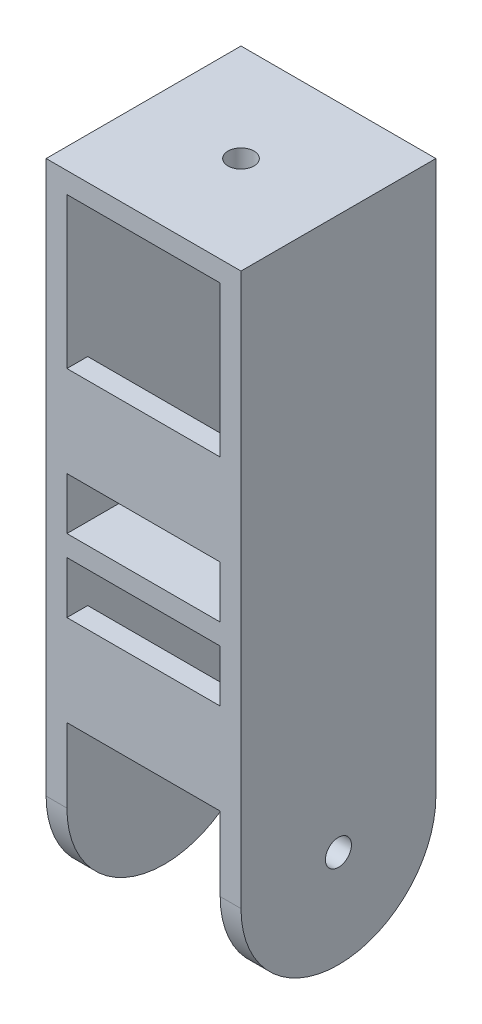
ISO-10303-21;
HEADER;
FILE_DESCRIPTION(('STEP AP214'),'2;1');
FILE_NAME('part.step','',(''),(''),'','','');
FILE_SCHEMA(('AUTOMOTIVE_DESIGN { 1 0 10303 214 1 1 1 1 }'));
ENDSEC;
DATA;
#1=APPLICATION_CONTEXT('core data for automotive mechanical design processes');
#2=APPLICATION_PROTOCOL_DEFINITION('international standard','automotive_design',2000,#1);
#3=PRODUCT_CONTEXT('',#1,'mechanical');
#4=PRODUCT('Part','Part','',(#3));
#5=PRODUCT_RELATED_PRODUCT_CATEGORY('part','',(#4));
#6=PRODUCT_DEFINITION_FORMATION('','',#4);
#7=PRODUCT_DEFINITION_CONTEXT('part definition',#1,'design');
#8=PRODUCT_DEFINITION('design','',#6,#7);
#9=PRODUCT_DEFINITION_SHAPE('','',#8);
#10=(LENGTH_UNIT() NAMED_UNIT(*) SI_UNIT(.MILLI.,.METRE.));
#11=(NAMED_UNIT(*) PLANE_ANGLE_UNIT() SI_UNIT($,.RADIAN.));
#12=(NAMED_UNIT(*) SI_UNIT($,.STERADIAN.) SOLID_ANGLE_UNIT());
#13=UNCERTAINTY_MEASURE_WITH_UNIT(LENGTH_MEASURE(1.E-05),#10,'distance_accuracy_value','');
#14=(GEOMETRIC_REPRESENTATION_CONTEXT(3) GLOBAL_UNCERTAINTY_ASSIGNED_CONTEXT((#13)) GLOBAL_UNIT_ASSIGNED_CONTEXT((#10,
#11,#12)) REPRESENTATION_CONTEXT('',''));
#15=CARTESIAN_POINT('',(0.,0.,0.));
#16=DIRECTION('',(0.,0.,1.));
#17=DIRECTION('',(1.,0.,0.));
#18=AXIS2_PLACEMENT_3D('',#15,#16,#17);
#19=CARTESIAN_POINT('',(59.5,-212.5,37.5));
#20=DIRECTION('',(-1.,0.,0.));
#21=DIRECTION('',(0.,-1.,0.));
#22=AXIS2_PLACEMENT_3D('',#19,#20,#21);
#23=PLANE('',#22);
#24=CARTESIAN_POINT('',(59.5,-212.5,37.5));
#25=DIRECTION('',(-1.,0.,0.));
#26=DIRECTION('',(0.,-1.,0.));
#27=AXIS2_PLACEMENT_3D('',#24,#25,#26);
#28=CIRCLE('',#27,15.);
#29=CARTESIAN_POINT('',(59.5,-227.5,37.5));
#30=VERTEX_POINT('',#29);
#31=EDGE_CURVE('E352',#30,#30,#28,.T.);
#32=ORIENTED_EDGE('',*,*,#31,.T.);
#33=EDGE_LOOP('',(#32));
#34=FACE_BOUND('',#33,.T.);
#35=CARTESIAN_POINT('',(59.5,-212.5,37.5));
#36=DIRECTION('',(-1.,0.,0.));
#37=DIRECTION('',(0.,-1.,0.));
#38=AXIS2_PLACEMENT_3D('',#35,#36,#37);
#39=CIRCLE('',#38,10.);
#40=CARTESIAN_POINT('',(59.5,-222.5,37.5));
#41=VERTEX_POINT('',#40);
#42=EDGE_CURVE('E348',#41,#41,#39,.T.);
#43=ORIENTED_EDGE('',*,*,#42,.F.);
#44=EDGE_LOOP('',(#43));
#45=FACE_BOUND('',#44,.T.);
#46=ADVANCED_FACE('F35',(#34,#45),#23,.T.);
#47=CARTESIAN_POINT('',(67.,0.,75.));
#48=DIRECTION('',(1.,0.,0.));
#49=DIRECTION('',(0.,1.,0.));
#50=AXIS2_PLACEMENT_3D('',#47,#48,#49);
#51=PLANE('',#50);
#52=DIRECTION('',(0.,1.,0.));
#53=VECTOR('',#52,1.);
#54=CARTESIAN_POINT('',(67.,-149.,67.));
#55=LINE('',#54,#53);
#56=CARTESIAN_POINT('',(67.,-184.,67.));
#57=VERTEX_POINT('',#56);
#58=CARTESIAN_POINT('',(67.,-149.,67.));
#59=VERTEX_POINT('',#58);
#60=EDGE_CURVE('E232',#57,#59,#55,.T.);
#61=ORIENTED_EDGE('',*,*,#60,.T.);
#62=DIRECTION('',(0.,0.,1.));
#63=VECTOR('',#62,1.);
#64=CARTESIAN_POINT('',(67.,-149.,67.));
#65=LINE('',#64,#63);
#66=CARTESIAN_POINT('',(67.,-149.,75.));
#67=VERTEX_POINT('',#66);
#68=EDGE_CURVE('E254',#59,#67,#65,.T.);
#69=ORIENTED_EDGE('',*,*,#68,.T.);
#70=DIRECTION('',(0.,-1.,0.));
#71=VECTOR('',#70,1.);
#72=CARTESIAN_POINT('',(67.,0.,75.));
#73=LINE('',#72,#71);
#74=CARTESIAN_POINT('',(67.,-129.,75.));
#75=VERTEX_POINT('',#74);
#76=EDGE_CURVE('E367',#75,#67,#73,.T.);
#77=ORIENTED_EDGE('',*,*,#76,.F.);
#78=DIRECTION('',(0.,0.,-1.));
#79=VECTOR('',#78,1.);
#80=CARTESIAN_POINT('',(67.,-129.,75.));
#81=LINE('',#80,#79);
#82=CARTESIAN_POINT('',(67.,-129.,0.));
#83=VERTEX_POINT('',#82);
#84=EDGE_CURVE('E430',#75,#83,#81,.T.);
#85=ORIENTED_EDGE('',*,*,#84,.T.);
#86=DIRECTION('',(0.,-1.,0.));
#87=VECTOR('',#86,1.);
#88=CARTESIAN_POINT('',(67.,0.,0.));
#89=LINE('',#88,#87);
#90=CARTESIAN_POINT('',(67.,-149.,0.));
#91=VERTEX_POINT('',#90);
#92=EDGE_CURVE('E396',#83,#91,#89,.T.);
#93=ORIENTED_EDGE('',*,*,#92,.T.);
#94=DIRECTION('',(0.,0.,1.));
#95=VECTOR('',#94,1.);
#96=CARTESIAN_POINT('',(67.,-149.,75.));
#97=LINE('',#96,#95);
#98=CARTESIAN_POINT('',(67.,-149.,7.99999999999999));
#99=VERTEX_POINT('',#98);
#100=EDGE_CURVE('E307',#91,#99,#97,.T.);
#101=ORIENTED_EDGE('',*,*,#100,.T.);
#102=DIRECTION('',(0.,1.,0.));
#103=VECTOR('',#102,1.);
#104=CARTESIAN_POINT('',(67.,0.,7.99999999999999));
#105=LINE('',#104,#103);
#106=CARTESIAN_POINT('',(67.,-184.,7.99999999999999));
#107=VERTEX_POINT('',#106);
#108=EDGE_CURVE('E312',#107,#99,#105,.T.);
#109=ORIENTED_EDGE('',*,*,#108,.F.);
#110=DIRECTION('',(0.,0.,-1.));
#111=VECTOR('',#110,1.);
#112=CARTESIAN_POINT('',(67.,-184.,75.));
#113=LINE('',#112,#111);
#114=CARTESIAN_POINT('',(67.,-184.,0.));
#115=VERTEX_POINT('',#114);
#116=EDGE_CURVE('E302',#107,#115,#113,.T.);
#117=ORIENTED_EDGE('',*,*,#116,.T.);
#118=CARTESIAN_POINT('',(67.,-212.5,0.));
#119=VERTEX_POINT('',#118);
#120=EDGE_CURVE('E395',#115,#119,#89,.T.);
#121=ORIENTED_EDGE('',*,*,#120,.T.);
#122=CARTESIAN_POINT('',(67.,-212.5,37.5));
#123=DIRECTION('',(1.,0.,0.));
#124=DIRECTION('',(0.,1.,0.));
#125=AXIS2_PLACEMENT_3D('',#122,#123,#124);
#126=CIRCLE('',#125,37.5);
#127=CARTESIAN_POINT('',(67.,-250.,37.5));
#128=VERTEX_POINT('',#127);
#129=EDGE_CURVE('E455',#119,#128,#126,.F.);
#130=ORIENTED_EDGE('',*,*,#129,.T.);
#131=CARTESIAN_POINT('',(67.,-212.5,37.5));
#132=DIRECTION('',(1.,0.,0.));
#133=DIRECTION('',(0.,1.,0.));
#134=AXIS2_PLACEMENT_3D('',#131,#132,#133);
#135=CIRCLE('',#134,37.5);
#136=CARTESIAN_POINT('',(67.,-212.5,75.));
#137=VERTEX_POINT('',#136);
#138=EDGE_CURVE('E453',#128,#137,#135,.F.);
#139=ORIENTED_EDGE('',*,*,#138,.T.);
#140=CARTESIAN_POINT('',(67.,-184.,75.));
#141=VERTEX_POINT('',#140);
#142=EDGE_CURVE('E253',#141,#137,#73,.T.);
#143=ORIENTED_EDGE('',*,*,#142,.F.);
#144=DIRECTION('',(0.,0.,1.));
#145=VECTOR('',#144,1.);
#146=CARTESIAN_POINT('',(67.,-184.,67.));
#147=LINE('',#146,#145);
#148=EDGE_CURVE('E246',#57,#141,#147,.T.);
#149=ORIENTED_EDGE('',*,*,#148,.F.);
#150=EDGE_LOOP('',(#61,#69,#77,#85,#93,#101,#109,#117,#121,#130,#139,#143,#149));
#151=FACE_BOUND('',#150,.T.);
#152=CARTESIAN_POINT('',(67.,-212.5,37.5));
#153=DIRECTION('',(1.,0.,0.));
#154=DIRECTION('',(0.,1.,0.));
#155=AXIS2_PLACEMENT_3D('',#152,#153,#154);
#156=CIRCLE('',#155,15.);
#157=CARTESIAN_POINT('',(67.,-197.5,37.5));
#158=VERTEX_POINT('',#157);
#159=EDGE_CURVE('E43',#158,#158,#156,.F.);
#160=ORIENTED_EDGE('',*,*,#159,.F.);
#161=EDGE_LOOP('',(#160));
#162=FACE_BOUND('',#161,.T.);
#163=ADVANCED_FACE('F250',(#151,#162),#51,.F.);
#164=CARTESIAN_POINT('',(0.,-121.,75.));
#165=DIRECTION('',(0.,1.,0.));
#166=DIRECTION('',(-1.,0.,0.));
#167=AXIS2_PLACEMENT_3D('',#164,#165,#166);
#168=PLANE('',#167);
#169=DIRECTION('',(1.,0.,0.));
#170=VECTOR('',#169,1.);
#171=CARTESIAN_POINT('',(0.,-121.,0.));
#172=LINE('',#171,#170);
#173=CARTESIAN_POINT('',(8.00000000000001,-121.,0.));
#174=VERTEX_POINT('',#173);
#175=CARTESIAN_POINT('',(67.,-121.,0.));
#176=VERTEX_POINT('',#175);
#177=EDGE_CURVE('E406',#174,#176,#172,.T.);
#178=ORIENTED_EDGE('',*,*,#177,.F.);
#179=DIRECTION('',(0.,0.,-1.));
#180=VECTOR('',#179,1.);
#181=CARTESIAN_POINT('',(8.00000000000001,-121.,75.));
#182=LINE('',#181,#180);
#183=CARTESIAN_POINT('',(8.00000000000001,-121.,75.));
#184=VERTEX_POINT('',#183);
#185=EDGE_CURVE('E422',#184,#174,#182,.T.);
#186=ORIENTED_EDGE('',*,*,#185,.F.);
#187=DIRECTION('',(1.,0.,0.));
#188=VECTOR('',#187,1.);
#189=CARTESIAN_POINT('',(0.,-121.,75.));
#190=LINE('',#189,#188);
#191=CARTESIAN_POINT('',(67.,-121.,75.));
#192=VERTEX_POINT('',#191);
#193=EDGE_CURVE('E380',#184,#192,#190,.T.);
#194=ORIENTED_EDGE('',*,*,#193,.T.);
#195=DIRECTION('',(0.,0.,-1.));
#196=VECTOR('',#195,1.);
#197=CARTESIAN_POINT('',(67.,-121.,75.));
#198=LINE('',#197,#196);
#199=EDGE_CURVE('E414',#192,#176,#198,.T.);
#200=ORIENTED_EDGE('',*,*,#199,.T.);
#201=EDGE_LOOP('',(#178,#186,#194,#200));
#202=FACE_BOUND('',#201,.T.);
#203=ADVANCED_FACE('F471',(#202),#168,.T.);
#204=CARTESIAN_POINT('',(8.,0.,75.));
#205=DIRECTION('',(1.,0.,0.));
#206=DIRECTION('',(0.,1.,0.));
#207=AXIS2_PLACEMENT_3D('',#204,#205,#206);
#208=PLANE('',#207);
#209=DIRECTION('',(0.,0.,1.));
#210=VECTOR('',#209,1.);
#211=CARTESIAN_POINT('',(8.00000000000001,-66.,67.));
#212=LINE('',#211,#210);
#213=CARTESIAN_POINT('',(8.00000000000001,-66.,67.));
#214=VERTEX_POINT('',#213);
#215=CARTESIAN_POINT('',(8.00000000000001,-66.,75.));
#216=VERTEX_POINT('',#215);
#217=EDGE_CURVE('E277',#214,#216,#212,.T.);
#218=ORIENTED_EDGE('',*,*,#217,.F.);
#219=DIRECTION('',(0.,-1.,0.));
#220=VECTOR('',#219,1.);
#221=CARTESIAN_POINT('',(8.00000000000001,-66.,67.));
#222=LINE('',#221,#220);
#223=CARTESIAN_POINT('',(8.00000000000001,-101.,67.));
#224=VERTEX_POINT('',#223);
#225=EDGE_CURVE('E260',#214,#224,#222,.T.);
#226=ORIENTED_EDGE('',*,*,#225,.T.);
#227=DIRECTION('',(0.,0.,1.));
#228=VECTOR('',#227,1.);
#229=CARTESIAN_POINT('',(8.00000000000001,-101.,67.));
#230=LINE('',#229,#228);
#231=CARTESIAN_POINT('',(8.00000000000001,-101.,75.));
#232=VERTEX_POINT('',#231);
#233=EDGE_CURVE('E272',#224,#232,#230,.T.);
#234=ORIENTED_EDGE('',*,*,#233,.T.);
#235=DIRECTION('',(0.,-1.,0.));
#236=VECTOR('',#235,1.);
#237=CARTESIAN_POINT('',(8.,0.,75.));
#238=LINE('',#237,#236);
#239=EDGE_CURVE('E383',#232,#184,#238,.T.);
#240=ORIENTED_EDGE('',*,*,#239,.T.);
#241=ORIENTED_EDGE('',*,*,#185,.T.);
#242=DIRECTION('',(0.,-1.,0.));
#243=VECTOR('',#242,1.);
#244=CARTESIAN_POINT('',(8.,0.,0.));
#245=LINE('',#244,#243);
#246=CARTESIAN_POINT('',(8.00000000000001,-101.,0.));
#247=VERTEX_POINT('',#246);
#248=EDGE_CURVE('E409',#247,#174,#245,.T.);
#249=ORIENTED_EDGE('',*,*,#248,.F.);
#250=DIRECTION('',(0.,0.,-1.));
#251=VECTOR('',#250,1.);
#252=CARTESIAN_POINT('',(8.00000000000001,-101.,75.));
#253=LINE('',#252,#251);
#254=CARTESIAN_POINT('',(8.00000000000001,-101.,8.));
#255=VERTEX_POINT('',#254);
#256=EDGE_CURVE('E329',#255,#247,#253,.T.);
#257=ORIENTED_EDGE('',*,*,#256,.F.);
#258=DIRECTION('',(0.,1.,0.));
#259=VECTOR('',#258,1.);
#260=CARTESIAN_POINT('',(8.,0.,7.99999999999999));
#261=LINE('',#260,#259);
#262=CARTESIAN_POINT('',(8.00000000000001,-66.,8.));
#263=VERTEX_POINT('',#262);
#264=EDGE_CURVE('E336',#255,#263,#261,.T.);
#265=ORIENTED_EDGE('',*,*,#264,.T.);
#266=DIRECTION('',(0.,0.,1.));
#267=VECTOR('',#266,1.);
#268=CARTESIAN_POINT('',(8.00000000000001,-66.,75.));
#269=LINE('',#268,#267);
#270=CARTESIAN_POINT('',(8.00000000000001,-66.,0.));
#271=VERTEX_POINT('',#270);
#272=EDGE_CURVE('E334',#271,#263,#269,.T.);
#273=ORIENTED_EDGE('',*,*,#272,.F.);
#274=CARTESIAN_POINT('',(8.,-8.00000000000001,0.));
#275=VERTEX_POINT('',#274);
#276=EDGE_CURVE('E393',#275,#271,#245,.T.);
#277=ORIENTED_EDGE('',*,*,#276,.F.);
#278=DIRECTION('',(0.,0.,-1.));
#279=VECTOR('',#278,1.);
#280=CARTESIAN_POINT('',(8.,-8.00000000000001,75.));
#281=LINE('',#280,#279);
#282=CARTESIAN_POINT('',(8.,-8.00000000000001,75.));
#283=VERTEX_POINT('',#282);
#284=EDGE_CURVE('E420',#283,#275,#281,.T.);
#285=ORIENTED_EDGE('',*,*,#284,.F.);
#286=EDGE_CURVE('E365',#283,#216,#238,.T.);
#287=ORIENTED_EDGE('',*,*,#286,.T.);
#288=EDGE_LOOP('',(#218,#226,#234,#240,#241,#249,#257,#265,#273,#277,#285,#287));
#289=FACE_BOUND('',#288,.T.);
#290=ADVANCED_FACE('F478',(#289),#208,.T.);
#291=CARTESIAN_POINT('',(0.,-8.00000000000001,75.));
#292=DIRECTION('',(0.,-1.,0.));
#293=DIRECTION('',(1.,0.,0.));
#294=AXIS2_PLACEMENT_3D('',#291,#292,#293);
#295=PLANE('',#294);
#296=CARTESIAN_POINT('',(37.5,-8.00000000000001,37.5));
#297=DIRECTION('',(0.,-1.,0.));
#298=DIRECTION('',(1.,0.,0.));
#299=AXIS2_PLACEMENT_3D('',#296,#297,#298);
#300=CIRCLE('',#299,5.);
#301=CARTESIAN_POINT('',(42.5,-8.00000000000001,37.5));
#302=VERTEX_POINT('',#301);
#303=EDGE_CURVE('E342',#302,#302,#300,.T.);
#304=ORIENTED_EDGE('',*,*,#303,.F.);
#305=EDGE_LOOP('',(#304));
#306=FACE_BOUND('',#305,.T.);
#307=DIRECTION('',(-1.,0.,0.));
#308=VECTOR('',#307,1.);
#309=CARTESIAN_POINT('',(0.,-8.00000000000001,0.));
#310=LINE('',#309,#308);
#311=CARTESIAN_POINT('',(67.,-8.,0.));
#312=VERTEX_POINT('',#311);
#313=EDGE_CURVE('E410',#312,#275,#310,.T.);
#314=ORIENTED_EDGE('',*,*,#313,.F.);
#315=DIRECTION('',(0.,0.,-1.));
#316=VECTOR('',#315,1.);
#317=CARTESIAN_POINT('',(67.,-8.,75.));
#318=LINE('',#317,#316);
#319=CARTESIAN_POINT('',(67.,-8.,75.));
#320=VERTEX_POINT('',#319);
#321=EDGE_CURVE('E417',#320,#312,#318,.T.);
#322=ORIENTED_EDGE('',*,*,#321,.F.);
#323=DIRECTION('',(-1.,0.,0.));
#324=VECTOR('',#323,1.);
#325=CARTESIAN_POINT('',(0.,-8.00000000000001,75.));
#326=LINE('',#325,#324);
#327=EDGE_CURVE('E384',#320,#283,#326,.T.);
#328=ORIENTED_EDGE('',*,*,#327,.T.);
#329=ORIENTED_EDGE('',*,*,#284,.T.);
#330=EDGE_LOOP('',(#314,#322,#328,#329));
#331=FACE_BOUND('',#330,.T.);
#332=ADVANCED_FACE('F556',(#306,#331),#295,.T.);
#333=DIRECTION('',(0.,0.,1.));
#334=VECTOR('',#333,1.);
#335=CARTESIAN_POINT('',(8.00000000000002,-149.,67.));
#336=LINE('',#335,#334);
#337=CARTESIAN_POINT('',(8.00000000000002,-149.,67.));
#338=VERTEX_POINT('',#337);
#339=CARTESIAN_POINT('',(8.00000000000002,-149.,75.));
#340=VERTEX_POINT('',#339);
#341=EDGE_CURVE('E55',#338,#340,#336,.T.);
#342=ORIENTED_EDGE('',*,*,#341,.F.);
#343=DIRECTION('',(0.,-1.,0.));
#344=VECTOR('',#343,1.);
#345=CARTESIAN_POINT('',(8.00000000000002,-149.,67.));
#346=LINE('',#345,#344);
#347=CARTESIAN_POINT('',(8.00000000000002,-184.,67.));
#348=VERTEX_POINT('',#347);
#349=EDGE_CURVE('E50',#338,#348,#346,.T.);
#350=ORIENTED_EDGE('',*,*,#349,.T.);
#351=DIRECTION('',(0.,0.,1.));
#352=VECTOR('',#351,1.);
#353=CARTESIAN_POINT('',(8.00000000000002,-184.,67.));
#354=LINE('',#353,#352);
#355=CARTESIAN_POINT('',(8.00000000000002,-184.,75.));
#356=VERTEX_POINT('',#355);
#357=EDGE_CURVE('E248',#348,#356,#354,.T.);
#358=ORIENTED_EDGE('',*,*,#357,.T.);
#359=CARTESIAN_POINT('',(8.00000000000003,-212.5,75.));
#360=VERTEX_POINT('',#359);
#361=EDGE_CURVE('E364',#356,#360,#238,.T.);
#362=ORIENTED_EDGE('',*,*,#361,.T.);
#363=CARTESIAN_POINT('',(8.00000000000003,-212.5,37.5));
#364=DIRECTION('',(1.,0.,0.));
#365=DIRECTION('',(0.,1.,0.));
#366=AXIS2_PLACEMENT_3D('',#363,#364,#365);
#367=CIRCLE('',#366,37.5);
#368=CARTESIAN_POINT('',(8.00000000000003,-250.,37.5));
#369=VERTEX_POINT('',#368);
#370=EDGE_CURVE('E425',#360,#369,#367,.T.);
#371=ORIENTED_EDGE('',*,*,#370,.T.);
#372=CARTESIAN_POINT('',(8.00000000000003,-212.5,37.5));
#373=DIRECTION('',(1.,0.,0.));
#374=DIRECTION('',(0.,1.,0.));
#375=AXIS2_PLACEMENT_3D('',#372,#373,#374);
#376=CIRCLE('',#375,37.5);
#377=CARTESIAN_POINT('',(8.00000000000003,-212.5,0.));
#378=VERTEX_POINT('',#377);
#379=EDGE_CURVE('E435',#369,#378,#376,.T.);
#380=ORIENTED_EDGE('',*,*,#379,.T.);
#381=CARTESIAN_POINT('',(8.00000000000002,-184.,0.));
#382=VERTEX_POINT('',#381);
#383=EDGE_CURVE('E392',#382,#378,#245,.T.);
#384=ORIENTED_EDGE('',*,*,#383,.F.);
#385=DIRECTION('',(0.,0.,-1.));
#386=VECTOR('',#385,1.);
#387=CARTESIAN_POINT('',(8.00000000000002,-184.,75.));
#388=LINE('',#387,#386);
#389=CARTESIAN_POINT('',(8.00000000000002,-184.,8.));
#390=VERTEX_POINT('',#389);
#391=EDGE_CURVE('E296',#390,#382,#388,.T.);
#392=ORIENTED_EDGE('',*,*,#391,.F.);
#393=DIRECTION('',(0.,1.,0.));
#394=VECTOR('',#393,1.);
#395=CARTESIAN_POINT('',(8.,0.,7.99999999999999));
#396=LINE('',#395,#394);
#397=CARTESIAN_POINT('',(8.00000000000002,-149.,8.));
#398=VERTEX_POINT('',#397);
#399=EDGE_CURVE('E309',#390,#398,#396,.T.);
#400=ORIENTED_EDGE('',*,*,#399,.T.);
#401=DIRECTION('',(0.,0.,1.));
#402=VECTOR('',#401,1.);
#403=CARTESIAN_POINT('',(8.00000000000002,-149.,75.));
#404=LINE('',#403,#402);
#405=CARTESIAN_POINT('',(8.00000000000002,-149.,0.));
#406=VERTEX_POINT('',#405);
#407=EDGE_CURVE('E305',#406,#398,#404,.T.);
#408=ORIENTED_EDGE('',*,*,#407,.F.);
#409=CARTESIAN_POINT('',(8.00000000000002,-129.,0.));
#410=VERTEX_POINT('',#409);
#411=EDGE_CURVE('E388',#410,#406,#245,.T.);
#412=ORIENTED_EDGE('',*,*,#411,.F.);
#413=DIRECTION('',(0.,0.,-1.));
#414=VECTOR('',#413,1.);
#415=CARTESIAN_POINT('',(8.00000000000002,-129.,75.));
#416=LINE('',#415,#414);
#417=CARTESIAN_POINT('',(8.00000000000002,-129.,75.));
#418=VERTEX_POINT('',#417);
#419=EDGE_CURVE('E418',#418,#410,#416,.T.);
#420=ORIENTED_EDGE('',*,*,#419,.F.);
#421=EDGE_CURVE('E361',#418,#340,#238,.T.);
#422=ORIENTED_EDGE('',*,*,#421,.T.);
#423=EDGE_LOOP('',(#342,#350,#358,#362,#371,#380,#384,#392,#400,#408,#412,#420,#422));
#424=FACE_BOUND('',#423,.T.);
#425=ADVANCED_FACE('F548',(#424),#208,.T.);
#426=CARTESIAN_POINT('',(0.,-129.,75.));
#427=DIRECTION('',(0.,1.,0.));
#428=DIRECTION('',(0.,0.,1.));
#429=AXIS2_PLACEMENT_3D('',#426,#427,#428);
#430=PLANE('',#429);
#431=DIRECTION('',(1.,0.,0.));
#432=VECTOR('',#431,1.);
#433=CARTESIAN_POINT('',(0.,-129.,0.));
#434=LINE('',#433,#432);
#435=EDGE_CURVE('E391',#410,#83,#434,.T.);
#436=ORIENTED_EDGE('',*,*,#435,.T.);
#437=ORIENTED_EDGE('',*,*,#84,.F.);
#438=DIRECTION('',(1.,0.,0.));
#439=VECTOR('',#438,1.);
#440=CARTESIAN_POINT('',(0.,-129.,75.));
#441=LINE('',#440,#439);
#442=EDGE_CURVE('E363',#418,#75,#441,.T.);
#443=ORIENTED_EDGE('',*,*,#442,.F.);
#444=ORIENTED_EDGE('',*,*,#419,.T.);
#445=EDGE_LOOP('',(#436,#437,#443,#444));
#446=FACE_BOUND('',#445,.T.);
#447=ADVANCED_FACE('F665',(#446),#430,.F.);
#448=CARTESIAN_POINT('',(75.,0.,75.));
#449=DIRECTION('',(1.,0.,0.));
#450=DIRECTION('',(0.,1.,0.));
#451=AXIS2_PLACEMENT_3D('',#448,#449,#450);
#452=PLANE('',#451);
#453=CARTESIAN_POINT('',(75.,-212.5,37.5));
#454=DIRECTION('',(1.,0.,0.));
#455=DIRECTION('',(0.,1.,0.));
#456=AXIS2_PLACEMENT_3D('',#453,#454,#455);
#457=CIRCLE('',#456,37.5);
#458=CARTESIAN_POINT('',(75.,-250.,37.5));
#459=VERTEX_POINT('',#458);
#460=CARTESIAN_POINT('',(75.,-212.5,0.));
#461=VERTEX_POINT('',#460);
#462=EDGE_CURVE('E450',#459,#461,#457,.T.);
#463=ORIENTED_EDGE('',*,*,#462,.T.);
#464=DIRECTION('',(0.,-1.,0.));
#465=VECTOR('',#464,1.);
#466=CARTESIAN_POINT('',(75.,0.,0.));
#467=LINE('',#466,#465);
#468=CARTESIAN_POINT('',(75.,0.,0.));
#469=VERTEX_POINT('',#468);
#470=EDGE_CURVE('E398',#469,#461,#467,.T.);
#471=ORIENTED_EDGE('',*,*,#470,.F.);
#472=DIRECTION('',(0.,0.,-1.));
#473=VECTOR('',#472,1.);
#474=CARTESIAN_POINT('',(75.,0.,75.));
#475=LINE('',#474,#473);
#476=CARTESIAN_POINT('',(75.,0.,75.));
#477=VERTEX_POINT('',#476);
#478=EDGE_CURVE('E428',#477,#469,#475,.T.);
#479=ORIENTED_EDGE('',*,*,#478,.F.);
#480=DIRECTION('',(0.,-1.,0.));
#481=VECTOR('',#480,1.);
#482=CARTESIAN_POINT('',(75.,0.,75.));
#483=LINE('',#482,#481);
#484=CARTESIAN_POINT('',(75.,-212.5,75.));
#485=VERTEX_POINT('',#484);
#486=EDGE_CURVE('E370',#477,#485,#483,.T.);
#487=ORIENTED_EDGE('',*,*,#486,.T.);
#488=CARTESIAN_POINT('',(75.,-212.5,37.5));
#489=DIRECTION('',(1.,0.,0.));
#490=DIRECTION('',(0.,1.,0.));
#491=AXIS2_PLACEMENT_3D('',#488,#489,#490);
#492=CIRCLE('',#491,37.5);
#493=EDGE_CURVE('E448',#485,#459,#492,.T.);
#494=ORIENTED_EDGE('',*,*,#493,.T.);
#495=EDGE_LOOP('',(#463,#471,#479,#487,#494));
#496=FACE_BOUND('',#495,.T.);
#497=CARTESIAN_POINT('',(75.,-212.5,37.5));
#498=DIRECTION('',(1.,0.,0.));
#499=DIRECTION('',(0.,1.,0.));
#500=AXIS2_PLACEMENT_3D('',#497,#498,#499);
#501=CIRCLE('',#500,5.);
#502=CARTESIAN_POINT('',(75.,-207.5,37.5));
#503=VERTEX_POINT('',#502);
#504=EDGE_CURVE('E357',#503,#503,#501,.T.);
#505=ORIENTED_EDGE('',*,*,#504,.F.);
#506=EDGE_LOOP('',(#505));
#507=FACE_BOUND('',#506,.T.);
#508=ADVANCED_FACE('F532',(#496,#507),#452,.T.);
#509=CARTESIAN_POINT('',(0.,0.,75.));
#510=DIRECTION('',(0.,1.,0.));
#511=DIRECTION('',(-1.,0.,0.));
#512=AXIS2_PLACEMENT_3D('',#509,#510,#511);
#513=PLANE('',#512);
#514=CARTESIAN_POINT('',(37.5,0.,37.5));
#515=DIRECTION('',(0.,1.,0.));
#516=DIRECTION('',(-1.,0.,0.));
#517=AXIS2_PLACEMENT_3D('',#514,#515,#516);
#518=CIRCLE('',#517,5.);
#519=CARTESIAN_POINT('',(32.5,0.,37.5));
#520=VERTEX_POINT('',#519);
#521=EDGE_CURVE('E339',#520,#520,#518,.T.);
#522=ORIENTED_EDGE('',*,*,#521,.F.);
#523=EDGE_LOOP('',(#522));
#524=FACE_BOUND('',#523,.T.);
#525=DIRECTION('',(1.,0.,0.));
#526=VECTOR('',#525,1.);
#527=CARTESIAN_POINT('',(0.,0.,0.));
#528=LINE('',#527,#526);
#529=CARTESIAN_POINT('',(0.,0.,0.));
#530=VERTEX_POINT('',#529);
#531=EDGE_CURVE('E401',#530,#469,#528,.T.);
#532=ORIENTED_EDGE('',*,*,#531,.F.);
#533=DIRECTION('',(0.,0.,-1.));
#534=VECTOR('',#533,1.);
#535=CARTESIAN_POINT('',(0.,0.,75.));
#536=LINE('',#535,#534);
#537=CARTESIAN_POINT('',(0.,0.,75.));
#538=VERTEX_POINT('',#537);
#539=EDGE_CURVE('E426',#538,#530,#536,.T.);
#540=ORIENTED_EDGE('',*,*,#539,.F.);
#541=DIRECTION('',(1.,0.,0.));
#542=VECTOR('',#541,1.);
#543=CARTESIAN_POINT('',(0.,0.,75.));
#544=LINE('',#543,#542);
#545=EDGE_CURVE('E374',#538,#477,#544,.T.);
#546=ORIENTED_EDGE('',*,*,#545,.T.);
#547=ORIENTED_EDGE('',*,*,#478,.T.);
#548=EDGE_LOOP('',(#532,#540,#546,#547));
#549=FACE_BOUND('',#548,.T.);
#550=ADVANCED_FACE('F496',(#524,#549),#513,.T.);
#551=CARTESIAN_POINT('',(0.,0.,75.));
#552=DIRECTION('',(1.,0.,0.));
#553=DIRECTION('',(0.,1.,0.));
#554=AXIS2_PLACEMENT_3D('',#551,#552,#553);
#555=PLANE('',#554);
#556=DIRECTION('',(0.,-1.,0.));
#557=VECTOR('',#556,1.);
#558=CARTESIAN_POINT('',(0.,0.,0.));
#559=LINE('',#558,#557);
#560=CARTESIAN_POINT('',(0.,-212.5,0.));
#561=VERTEX_POINT('',#560);
#562=EDGE_CURVE('E404',#530,#561,#559,.T.);
#563=ORIENTED_EDGE('',*,*,#562,.T.);
#564=CARTESIAN_POINT('',(0.,-212.5,37.5));
#565=DIRECTION('',(1.,0.,0.));
#566=DIRECTION('',(0.,1.,0.));
#567=AXIS2_PLACEMENT_3D('',#564,#565,#566);
#568=CIRCLE('',#567,37.5);
#569=CARTESIAN_POINT('',(0.,-250.,37.5));
#570=VERTEX_POINT('',#569);
#571=EDGE_CURVE('E446',#561,#570,#568,.F.);
#572=ORIENTED_EDGE('',*,*,#571,.T.);
#573=CARTESIAN_POINT('',(0.,-212.5,37.5));
#574=DIRECTION('',(1.,0.,0.));
#575=DIRECTION('',(0.,1.,0.));
#576=AXIS2_PLACEMENT_3D('',#573,#574,#575);
#577=CIRCLE('',#576,37.5);
#578=CARTESIAN_POINT('',(0.,-212.5,75.));
#579=VERTEX_POINT('',#578);
#580=EDGE_CURVE('E444',#570,#579,#577,.F.);
#581=ORIENTED_EDGE('',*,*,#580,.T.);
#582=DIRECTION('',(0.,-1.,0.));
#583=VECTOR('',#582,1.);
#584=CARTESIAN_POINT('',(0.,0.,75.));
#585=LINE('',#584,#583);
#586=EDGE_CURVE('E377',#538,#579,#585,.T.);
#587=ORIENTED_EDGE('',*,*,#586,.F.);
#588=ORIENTED_EDGE('',*,*,#539,.T.);
#589=EDGE_LOOP('',(#563,#572,#581,#587,#588));
#590=FACE_BOUND('',#589,.T.);
#591=ADVANCED_FACE('F487',(#590),#555,.F.);
#592=DIRECTION('',(0.,1.,0.));
#593=VECTOR('',#592,1.);
#594=CARTESIAN_POINT('',(67.,-66.,67.));
#595=LINE('',#594,#593);
#596=CARTESIAN_POINT('',(67.,-101.,67.));
#597=VERTEX_POINT('',#596);
#598=CARTESIAN_POINT('',(67.,-66.,67.));
#599=VERTEX_POINT('',#598);
#600=EDGE_CURVE('E266',#597,#599,#595,.T.);
#601=ORIENTED_EDGE('',*,*,#600,.T.);
#602=DIRECTION('',(0.,0.,1.));
#603=VECTOR('',#602,1.);
#604=CARTESIAN_POINT('',(67.,-66.,67.));
#605=LINE('',#604,#603);
#606=CARTESIAN_POINT('',(67.,-66.,75.));
#607=VERTEX_POINT('',#606);
#608=EDGE_CURVE('E281',#599,#607,#605,.T.);
#609=ORIENTED_EDGE('',*,*,#608,.T.);
#610=EDGE_CURVE('E371',#320,#607,#73,.T.);
#611=ORIENTED_EDGE('',*,*,#610,.F.);
#612=ORIENTED_EDGE('',*,*,#321,.T.);
#613=CARTESIAN_POINT('',(67.,-66.,0.));
#614=VERTEX_POINT('',#613);
#615=EDGE_CURVE('E399',#312,#614,#89,.T.);
#616=ORIENTED_EDGE('',*,*,#615,.T.);
#617=DIRECTION('',(0.,0.,1.));
#618=VECTOR('',#617,1.);
#619=CARTESIAN_POINT('',(67.,-66.,75.));
#620=LINE('',#619,#618);
#621=CARTESIAN_POINT('',(67.,-66.,7.99999999999999));
#622=VERTEX_POINT('',#621);
#623=EDGE_CURVE('E332',#614,#622,#620,.T.);
#624=ORIENTED_EDGE('',*,*,#623,.T.);
#625=DIRECTION('',(0.,1.,0.));
#626=VECTOR('',#625,1.);
#627=CARTESIAN_POINT('',(67.,0.,7.99999999999999));
#628=LINE('',#627,#626);
#629=CARTESIAN_POINT('',(67.,-101.,7.99999999999999));
#630=VERTEX_POINT('',#629);
#631=EDGE_CURVE('E11',#630,#622,#628,.T.);
#632=ORIENTED_EDGE('',*,*,#631,.F.);
#633=DIRECTION('',(0.,0.,-1.));
#634=VECTOR('',#633,1.);
#635=CARTESIAN_POINT('',(67.,-101.,75.));
#636=LINE('',#635,#634);
#637=CARTESIAN_POINT('',(67.,-101.,0.));
#638=VERTEX_POINT('',#637);
#639=EDGE_CURVE('E323',#630,#638,#636,.T.);
#640=ORIENTED_EDGE('',*,*,#639,.T.);
#641=EDGE_CURVE('E413',#638,#176,#89,.T.);
#642=ORIENTED_EDGE('',*,*,#641,.T.);
#643=ORIENTED_EDGE('',*,*,#199,.F.);
#644=CARTESIAN_POINT('',(67.,-101.,75.));
#645=VERTEX_POINT('',#644);
#646=EDGE_CURVE('E387',#645,#192,#73,.T.);
#647=ORIENTED_EDGE('',*,*,#646,.F.);
#648=DIRECTION('',(0.,0.,1.));
#649=VECTOR('',#648,1.);
#650=CARTESIAN_POINT('',(67.,-101.,67.));
#651=LINE('',#650,#649);
#652=EDGE_CURVE('E284',#597,#645,#651,.T.);
#653=ORIENTED_EDGE('',*,*,#652,.F.);
#654=EDGE_LOOP('',(#601,#609,#611,#612,#616,#624,#632,#640,#642,#643,#647,#653));
#655=FACE_BOUND('',#654,.T.);
#656=ADVANCED_FACE('F473',(#655),#51,.F.);
#657=CARTESIAN_POINT('',(0.,0.,75.));
#658=DIRECTION('',(0.,0.,1.));
#659=DIRECTION('',(1.,0.,0.));
#660=AXIS2_PLACEMENT_3D('',#657,#658,#659);
#661=PLANE('',#660);
#662=ORIENTED_EDGE('',*,*,#361,.F.);
#663=DIRECTION('',(1.,0.,0.));
#664=VECTOR('',#663,1.);
#665=CARTESIAN_POINT('',(8.00000000000002,-184.,75.));
#666=LINE('',#665,#664);
#667=EDGE_CURVE('E524',#356,#141,#666,.T.);
#668=ORIENTED_EDGE('',*,*,#667,.T.);
#669=ORIENTED_EDGE('',*,*,#142,.T.);
#670=DIRECTION('',(1.,0.,0.));
#671=VECTOR('',#670,1.);
#672=CARTESIAN_POINT('',(75.,-212.5,75.));
#673=LINE('',#672,#671);
#674=EDGE_CURVE('E460',#137,#485,#673,.T.);
#675=ORIENTED_EDGE('',*,*,#674,.T.);
#676=ORIENTED_EDGE('',*,*,#486,.F.);
#677=ORIENTED_EDGE('',*,*,#545,.F.);
#678=ORIENTED_EDGE('',*,*,#586,.T.);
#679=DIRECTION('',(1.,0.,0.));
#680=VECTOR('',#679,1.);
#681=CARTESIAN_POINT('',(8.00000000000003,-212.5,75.));
#682=LINE('',#681,#680);
#683=EDGE_CURVE('E457',#579,#360,#682,.T.);
#684=ORIENTED_EDGE('',*,*,#683,.T.);
#685=EDGE_LOOP('',(#662,#668,#669,#675,#676,#677,#678,#684));
#686=FACE_BOUND('',#685,.T.);
#687=ORIENTED_EDGE('',*,*,#239,.F.);
#688=DIRECTION('',(1.,0.,0.));
#689=VECTOR('',#688,1.);
#690=CARTESIAN_POINT('',(8.00000000000001,-101.,75.));
#691=LINE('',#690,#689);
#692=EDGE_CURVE('E273',#232,#645,#691,.T.);
#693=ORIENTED_EDGE('',*,*,#692,.T.);
#694=ORIENTED_EDGE('',*,*,#646,.T.);
#695=ORIENTED_EDGE('',*,*,#193,.F.);
#696=EDGE_LOOP('',(#687,#693,#694,#695));
#697=FACE_BOUND('',#696,.T.);
#698=ORIENTED_EDGE('',*,*,#76,.T.);
#699=DIRECTION('',(-1.,0.,0.));
#700=VECTOR('',#699,1.);
#701=CARTESIAN_POINT('',(8.00000000000002,-149.,75.));
#702=LINE('',#701,#700);
#703=EDGE_CURVE('E578',#67,#340,#702,.T.);
#704=ORIENTED_EDGE('',*,*,#703,.T.);
#705=ORIENTED_EDGE('',*,*,#421,.F.);
#706=ORIENTED_EDGE('',*,*,#442,.T.);
#707=EDGE_LOOP('',(#698,#704,#705,#706));
#708=FACE_BOUND('',#707,.T.);
#709=DIRECTION('',(-1.,0.,0.));
#710=VECTOR('',#709,1.);
#711=CARTESIAN_POINT('',(8.00000000000001,-66.,75.));
#712=LINE('',#711,#710);
#713=EDGE_CURVE('E263',#607,#216,#712,.T.);
#714=ORIENTED_EDGE('',*,*,#713,.T.);
#715=ORIENTED_EDGE('',*,*,#286,.F.);
#716=ORIENTED_EDGE('',*,*,#327,.F.);
#717=ORIENTED_EDGE('',*,*,#610,.T.);
#718=EDGE_LOOP('',(#714,#715,#716,#717));
#719=FACE_BOUND('',#718,.T.);
#720=ADVANCED_FACE('F486',(#686,#697,#708,#719),#661,.T.);
#721=CARTESIAN_POINT('',(0.,0.,0.));
#722=DIRECTION('',(0.,0.,1.));
#723=DIRECTION('',(1.,0.,0.));
#724=AXIS2_PLACEMENT_3D('',#721,#722,#723);
#725=PLANE('',#724);
#726=ORIENTED_EDGE('',*,*,#120,.F.);
#727=DIRECTION('',(-1.,0.,0.));
#728=VECTOR('',#727,1.);
#729=CARTESIAN_POINT('',(75.,-184.,0.));
#730=LINE('',#729,#728);
#731=EDGE_CURVE('E280',#115,#382,#730,.T.);
#732=ORIENTED_EDGE('',*,*,#731,.T.);
#733=ORIENTED_EDGE('',*,*,#383,.T.);
#734=DIRECTION('',(1.,0.,0.));
#735=VECTOR('',#734,1.);
#736=CARTESIAN_POINT('',(0.,-212.5,0.));
#737=LINE('',#736,#735);
#738=EDGE_CURVE('E441',#378,#561,#737,.F.);
#739=ORIENTED_EDGE('',*,*,#738,.T.);
#740=ORIENTED_EDGE('',*,*,#562,.F.);
#741=ORIENTED_EDGE('',*,*,#531,.T.);
#742=ORIENTED_EDGE('',*,*,#470,.T.);
#743=DIRECTION('',(1.,0.,0.));
#744=VECTOR('',#743,1.);
#745=CARTESIAN_POINT('',(0.,-212.5,0.));
#746=LINE('',#745,#744);
#747=EDGE_CURVE('E438',#461,#119,#746,.F.);
#748=ORIENTED_EDGE('',*,*,#747,.T.);
#749=EDGE_LOOP('',(#726,#732,#733,#739,#740,#741,#742,#748));
#750=FACE_BOUND('',#749,.T.);
#751=DIRECTION('',(1.,0.,0.));
#752=VECTOR('',#751,1.);
#753=CARTESIAN_POINT('',(75.,-149.,0.));
#754=LINE('',#753,#752);
#755=EDGE_CURVE('E293',#406,#91,#754,.T.);
#756=ORIENTED_EDGE('',*,*,#755,.T.);
#757=ORIENTED_EDGE('',*,*,#92,.F.);
#758=ORIENTED_EDGE('',*,*,#435,.F.);
#759=ORIENTED_EDGE('',*,*,#411,.T.);
#760=EDGE_LOOP('',(#756,#757,#758,#759));
#761=FACE_BOUND('',#760,.T.);
#762=DIRECTION('',(-1.,0.,0.));
#763=VECTOR('',#762,1.);
#764=CARTESIAN_POINT('',(75.,-101.,0.));
#765=LINE('',#764,#763);
#766=EDGE_CURVE('E315',#638,#247,#765,.T.);
#767=ORIENTED_EDGE('',*,*,#766,.T.);
#768=ORIENTED_EDGE('',*,*,#248,.T.);
#769=ORIENTED_EDGE('',*,*,#177,.T.);
#770=ORIENTED_EDGE('',*,*,#641,.F.);
#771=EDGE_LOOP('',(#767,#768,#769,#770));
#772=FACE_BOUND('',#771,.T.);
#773=ORIENTED_EDGE('',*,*,#276,.T.);
#774=DIRECTION('',(1.,0.,0.));
#775=VECTOR('',#774,1.);
#776=CARTESIAN_POINT('',(75.,-66.,0.));
#777=LINE('',#776,#775);
#778=EDGE_CURVE('E320',#271,#614,#777,.T.);
#779=ORIENTED_EDGE('',*,*,#778,.T.);
#780=ORIENTED_EDGE('',*,*,#615,.F.);
#781=ORIENTED_EDGE('',*,*,#313,.T.);
#782=EDGE_LOOP('',(#773,#779,#780,#781));
#783=FACE_BOUND('',#782,.T.);
#784=ADVANCED_FACE('F493',(#750,#761,#772,#783),#725,.F.);
#785=CARTESIAN_POINT('',(0.,-212.5,37.5));
#786=DIRECTION('',(-1.,0.,0.));
#787=DIRECTION('',(0.,0.,1.));
#788=AXIS2_PLACEMENT_3D('',#785,#786,#787);
#789=CYLINDRICAL_SURFACE('',#788,37.5);
#790=ORIENTED_EDGE('',*,*,#683,.F.);
#791=ORIENTED_EDGE('',*,*,#580,.F.);
#792=DIRECTION('',(1.,0.,0.));
#793=VECTOR('',#792,1.);
#794=CARTESIAN_POINT('',(0.,-250.,37.5));
#795=LINE('',#794,#793);
#796=EDGE_CURVE('E462',#369,#570,#795,.F.);
#797=ORIENTED_EDGE('',*,*,#796,.F.);
#798=ORIENTED_EDGE('',*,*,#370,.F.);
#799=EDGE_LOOP('',(#790,#791,#797,#798));
#800=FACE_BOUND('',#799,.T.);
#801=ADVANCED_FACE('F545',(#800),#789,.T.);
#802=CARTESIAN_POINT('',(0.,-212.5,37.5));
#803=DIRECTION('',(1.,0.,0.));
#804=DIRECTION('',(0.,0.,-1.));
#805=AXIS2_PLACEMENT_3D('',#802,#803,#804);
#806=CYLINDRICAL_SURFACE('',#805,37.5);
#807=ORIENTED_EDGE('',*,*,#571,.F.);
#808=ORIENTED_EDGE('',*,*,#738,.F.);
#809=ORIENTED_EDGE('',*,*,#379,.F.);
#810=ORIENTED_EDGE('',*,*,#796,.T.);
#811=EDGE_LOOP('',(#807,#808,#809,#810));
#812=FACE_BOUND('',#811,.T.);
#813=ADVANCED_FACE('F644',(#812),#806,.T.);
#814=CARTESIAN_POINT('',(0.,-212.5,37.5));
#815=DIRECTION('',(-1.,0.,0.));
#816=DIRECTION('',(0.,0.,1.));
#817=AXIS2_PLACEMENT_3D('',#814,#815,#816);
#818=CYLINDRICAL_SURFACE('',#817,37.5);
#819=ORIENTED_EDGE('',*,*,#674,.F.);
#820=ORIENTED_EDGE('',*,*,#138,.F.);
#821=DIRECTION('',(1.,0.,0.));
#822=VECTOR('',#821,1.);
#823=CARTESIAN_POINT('',(67.,-250.,37.5));
#824=LINE('',#823,#822);
#825=EDGE_CURVE('E360',#459,#128,#824,.F.);
#826=ORIENTED_EDGE('',*,*,#825,.F.);
#827=ORIENTED_EDGE('',*,*,#493,.F.);
#828=EDGE_LOOP('',(#819,#820,#826,#827));
#829=FACE_BOUND('',#828,.T.);
#830=ADVANCED_FACE('F37',(#829),#818,.T.);
#831=CARTESIAN_POINT('',(0.,-212.5,37.5));
#832=DIRECTION('',(1.,0.,0.));
#833=DIRECTION('',(0.,0.,-1.));
#834=AXIS2_PLACEMENT_3D('',#831,#832,#833);
#835=CYLINDRICAL_SURFACE('',#834,37.5);
#836=ORIENTED_EDGE('',*,*,#129,.F.);
#837=ORIENTED_EDGE('',*,*,#747,.F.);
#838=ORIENTED_EDGE('',*,*,#462,.F.);
#839=ORIENTED_EDGE('',*,*,#825,.T.);
#840=EDGE_LOOP('',(#836,#837,#838,#839));
#841=FACE_BOUND('',#840,.T.);
#842=ADVANCED_FACE('F637',(#841),#835,.T.);
#843=CARTESIAN_POINT('',(65.,-212.5,37.5));
#844=DIRECTION('',(1.,0.,0.));
#845=DIRECTION('',(0.,1.,0.));
#846=AXIS2_PLACEMENT_3D('',#843,#844,#845);
#847=CYLINDRICAL_SURFACE('',#846,5.);
#848=ORIENTED_EDGE('',*,*,#504,.T.);
#849=EDGE_LOOP('',(#848));
#850=FACE_BOUND('',#849,.T.);
#851=CARTESIAN_POINT('',(52.,-212.5,37.5));
#852=DIRECTION('',(-1.,0.,0.));
#853=DIRECTION('',(0.,-1.,0.));
#854=AXIS2_PLACEMENT_3D('',#851,#852,#853);
#855=CIRCLE('',#854,5.);
#856=CARTESIAN_POINT('',(52.,-217.5,37.5));
#857=VERTEX_POINT('',#856);
#858=EDGE_CURVE('E345',#857,#857,#855,.T.);
#859=ORIENTED_EDGE('',*,*,#858,.T.);
#860=EDGE_LOOP('',(#859));
#861=FACE_BOUND('',#860,.T.);
#862=ADVANCED_FACE('F634',(#850,#861),#847,.F.);
#863=CARTESIAN_POINT('',(59.5,-212.5,37.5));
#864=DIRECTION('',(1.,0.,0.));
#865=DIRECTION('',(0.,1.,0.));
#866=AXIS2_PLACEMENT_3D('',#863,#864,#865);
#867=CYLINDRICAL_SURFACE('',#866,15.);
#868=ORIENTED_EDGE('',*,*,#31,.F.);
#869=EDGE_LOOP('',(#868));
#870=FACE_BOUND('',#869,.T.);
#871=ORIENTED_EDGE('',*,*,#159,.T.);
#872=EDGE_LOOP('',(#871));
#873=FACE_BOUND('',#872,.T.);
#874=ADVANCED_FACE('F469',(#870,#873),#867,.T.);
#875=CARTESIAN_POINT('',(52.,-212.5,37.5));
#876=DIRECTION('',(-1.,0.,0.));
#877=DIRECTION('',(0.,-1.,0.));
#878=AXIS2_PLACEMENT_3D('',#875,#876,#877);
#879=PLANE('',#878);
#880=CARTESIAN_POINT('',(52.,-212.5,37.5));
#881=DIRECTION('',(-1.,0.,0.));
#882=DIRECTION('',(0.,-1.,0.));
#883=AXIS2_PLACEMENT_3D('',#880,#881,#882);
#884=CIRCLE('',#883,10.);
#885=CARTESIAN_POINT('',(52.,-222.5,37.5));
#886=VERTEX_POINT('',#885);
#887=EDGE_CURVE('E349',#886,#886,#884,.T.);
#888=ORIENTED_EDGE('',*,*,#887,.T.);
#889=EDGE_LOOP('',(#888));
#890=FACE_BOUND('',#889,.T.);
#891=ORIENTED_EDGE('',*,*,#858,.F.);
#892=EDGE_LOOP('',(#891));
#893=FACE_BOUND('',#892,.T.);
#894=ADVANCED_FACE('F625',(#890,#893),#879,.T.);
#895=CARTESIAN_POINT('',(52.,-212.5,37.5));
#896=DIRECTION('',(1.,0.,0.));
#897=DIRECTION('',(0.,1.,0.));
#898=AXIS2_PLACEMENT_3D('',#895,#896,#897);
#899=CYLINDRICAL_SURFACE('',#898,10.);
#900=ORIENTED_EDGE('',*,*,#887,.F.);
#901=EDGE_LOOP('',(#900));
#902=FACE_BOUND('',#901,.T.);
#903=ORIENTED_EDGE('',*,*,#42,.T.);
#904=EDGE_LOOP('',(#903));
#905=FACE_BOUND('',#904,.T.);
#906=ADVANCED_FACE('F623',(#902,#905),#899,.T.);
#907=CARTESIAN_POINT('',(37.5,-10.,37.5));
#908=DIRECTION('',(0.,1.,0.));
#909=DIRECTION('',(-1.,0.,0.));
#910=AXIS2_PLACEMENT_3D('',#907,#908,#909);
#911=CYLINDRICAL_SURFACE('',#910,5.);
#912=ORIENTED_EDGE('',*,*,#303,.T.);
#913=EDGE_LOOP('',(#912));
#914=FACE_BOUND('',#913,.T.);
#915=ORIENTED_EDGE('',*,*,#521,.T.);
#916=EDGE_LOOP('',(#915));
#917=FACE_BOUND('',#916,.T.);
#918=ADVANCED_FACE('F616',(#914,#917),#911,.F.);
#919=CARTESIAN_POINT('',(0.,0.,8.));
#920=DIRECTION('',(0.,0.,-1.));
#921=DIRECTION('',(-1.,0.,0.));
#922=AXIS2_PLACEMENT_3D('',#919,#920,#921);
#923=PLANE('',#922);
#924=ORIENTED_EDGE('',*,*,#264,.F.);
#925=DIRECTION('',(-1.,0.,0.));
#926=VECTOR('',#925,1.);
#927=CARTESIAN_POINT('',(75.,-101.,8.));
#928=LINE('',#927,#926);
#929=EDGE_CURVE('E316',#630,#255,#928,.T.);
#930=ORIENTED_EDGE('',*,*,#929,.F.);
#931=ORIENTED_EDGE('',*,*,#631,.T.);
#932=DIRECTION('',(1.,0.,0.));
#933=VECTOR('',#932,1.);
#934=CARTESIAN_POINT('',(75.,-66.,8.));
#935=LINE('',#934,#933);
#936=EDGE_CURVE('E319',#263,#622,#935,.T.);
#937=ORIENTED_EDGE('',*,*,#936,.F.);
#938=EDGE_LOOP('',(#924,#930,#931,#937));
#939=FACE_BOUND('',#938,.T.);
#940=ADVANCED_FACE('F567',(#939),#923,.F.);
#941=CARTESIAN_POINT('',(75.,-66.,8.));
#942=DIRECTION('',(0.,1.,0.));
#943=DIRECTION('',(0.,0.,1.));
#944=AXIS2_PLACEMENT_3D('',#941,#942,#943);
#945=PLANE('',#944);
#946=ORIENTED_EDGE('',*,*,#778,.F.);
#947=ORIENTED_EDGE('',*,*,#272,.T.);
#948=ORIENTED_EDGE('',*,*,#936,.T.);
#949=ORIENTED_EDGE('',*,*,#623,.F.);
#950=EDGE_LOOP('',(#946,#947,#948,#949));
#951=FACE_BOUND('',#950,.T.);
#952=ADVANCED_FACE('F561',(#951),#945,.T.);
#953=CARTESIAN_POINT('',(75.,-101.,8.));
#954=DIRECTION('',(0.,-1.,0.));
#955=DIRECTION('',(0.,0.,-1.));
#956=AXIS2_PLACEMENT_3D('',#953,#954,#955);
#957=PLANE('',#956);
#958=ORIENTED_EDGE('',*,*,#929,.T.);
#959=ORIENTED_EDGE('',*,*,#256,.T.);
#960=ORIENTED_EDGE('',*,*,#766,.F.);
#961=ORIENTED_EDGE('',*,*,#639,.F.);
#962=EDGE_LOOP('',(#958,#959,#960,#961));
#963=FACE_BOUND('',#962,.T.);
#964=ADVANCED_FACE('F570',(#963),#957,.T.);
#965=CARTESIAN_POINT('',(0.,0.,8.));
#966=DIRECTION('',(0.,0.,-1.));
#967=DIRECTION('',(-1.,0.,0.));
#968=AXIS2_PLACEMENT_3D('',#965,#966,#967);
#969=PLANE('',#968);
#970=DIRECTION('',(-1.,0.,0.));
#971=VECTOR('',#970,1.);
#972=CARTESIAN_POINT('',(75.,-184.,8.));
#973=LINE('',#972,#971);
#974=EDGE_CURVE('E289',#107,#390,#973,.T.);
#975=ORIENTED_EDGE('',*,*,#974,.F.);
#976=ORIENTED_EDGE('',*,*,#108,.T.);
#977=DIRECTION('',(1.,0.,0.));
#978=VECTOR('',#977,1.);
#979=CARTESIAN_POINT('',(75.,-149.,8.));
#980=LINE('',#979,#978);
#981=EDGE_CURVE('E292',#398,#99,#980,.T.);
#982=ORIENTED_EDGE('',*,*,#981,.F.);
#983=ORIENTED_EDGE('',*,*,#399,.F.);
#984=EDGE_LOOP('',(#975,#976,#982,#983));
#985=FACE_BOUND('',#984,.T.);
#986=ADVANCED_FACE('F603',(#985),#969,.F.);
#987=CARTESIAN_POINT('',(75.,-149.,8.));
#988=DIRECTION('',(0.,1.,0.));
#989=DIRECTION('',(0.,0.,1.));
#990=AXIS2_PLACEMENT_3D('',#987,#988,#989);
#991=PLANE('',#990);
#992=ORIENTED_EDGE('',*,*,#100,.F.);
#993=ORIENTED_EDGE('',*,*,#755,.F.);
#994=ORIENTED_EDGE('',*,*,#407,.T.);
#995=ORIENTED_EDGE('',*,*,#981,.T.);
#996=EDGE_LOOP('',(#992,#993,#994,#995));
#997=FACE_BOUND('',#996,.T.);
#998=ADVANCED_FACE('F606',(#997),#991,.T.);
#999=CARTESIAN_POINT('',(75.,-184.,8.));
#1000=DIRECTION('',(0.,-1.,0.));
#1001=DIRECTION('',(0.,0.,-1.));
#1002=AXIS2_PLACEMENT_3D('',#999,#1000,#1001);
#1003=PLANE('',#1002);
#1004=ORIENTED_EDGE('',*,*,#116,.F.);
#1005=ORIENTED_EDGE('',*,*,#974,.T.);
#1006=ORIENTED_EDGE('',*,*,#391,.T.);
#1007=ORIENTED_EDGE('',*,*,#731,.F.);
#1008=EDGE_LOOP('',(#1004,#1005,#1006,#1007));
#1009=FACE_BOUND('',#1008,.T.);
#1010=ADVANCED_FACE('F600',(#1009),#1003,.T.);
#1011=CARTESIAN_POINT('',(8.00000000000001,-66.,67.));
#1012=DIRECTION('',(0.,1.,0.));
#1013=DIRECTION('',(0.,0.,1.));
#1014=AXIS2_PLACEMENT_3D('',#1011,#1012,#1013);
#1015=PLANE('',#1014);
#1016=ORIENTED_EDGE('',*,*,#713,.F.);
#1017=ORIENTED_EDGE('',*,*,#608,.F.);
#1018=DIRECTION('',(-1.,0.,0.));
#1019=VECTOR('',#1018,1.);
#1020=CARTESIAN_POINT('',(8.00000000000001,-66.,67.));
#1021=LINE('',#1020,#1019);
#1022=EDGE_CURVE('E269',#599,#214,#1021,.T.);
#1023=ORIENTED_EDGE('',*,*,#1022,.T.);
#1024=ORIENTED_EDGE('',*,*,#217,.T.);
#1025=EDGE_LOOP('',(#1016,#1017,#1023,#1024));
#1026=FACE_BOUND('',#1025,.T.);
#1027=ADVANCED_FACE('F515',(#1026),#1015,.T.);
#1028=CARTESIAN_POINT('',(8.00000000000001,-101.,67.));
#1029=DIRECTION('',(0.,-1.,0.));
#1030=DIRECTION('',(0.,0.,-1.));
#1031=AXIS2_PLACEMENT_3D('',#1028,#1029,#1030);
#1032=PLANE('',#1031);
#1033=ORIENTED_EDGE('',*,*,#692,.F.);
#1034=ORIENTED_EDGE('',*,*,#233,.F.);
#1035=DIRECTION('',(1.,0.,0.));
#1036=VECTOR('',#1035,1.);
#1037=CARTESIAN_POINT('',(8.00000000000001,-101.,67.));
#1038=LINE('',#1037,#1036);
#1039=EDGE_CURVE('E262',#224,#597,#1038,.T.);
#1040=ORIENTED_EDGE('',*,*,#1039,.T.);
#1041=ORIENTED_EDGE('',*,*,#652,.T.);
#1042=EDGE_LOOP('',(#1033,#1034,#1040,#1041));
#1043=FACE_BOUND('',#1042,.T.);
#1044=ADVANCED_FACE('F511',(#1043),#1032,.T.);
#1045=CARTESIAN_POINT('',(0.,0.,67.));
#1046=DIRECTION('',(0.,0.,1.));
#1047=DIRECTION('',(1.,0.,0.));
#1048=AXIS2_PLACEMENT_3D('',#1045,#1046,#1047);
#1049=PLANE('',#1048);
#1050=ORIENTED_EDGE('',*,*,#225,.F.);
#1051=ORIENTED_EDGE('',*,*,#1022,.F.);
#1052=ORIENTED_EDGE('',*,*,#600,.F.);
#1053=ORIENTED_EDGE('',*,*,#1039,.F.);
#1054=EDGE_LOOP('',(#1050,#1051,#1052,#1053));
#1055=FACE_BOUND('',#1054,.T.);
#1056=ADVANCED_FACE('F507',(#1055),#1049,.F.);
#1057=CARTESIAN_POINT('',(8.00000000000002,-149.,67.));
#1058=DIRECTION('',(0.,1.,0.));
#1059=DIRECTION('',(0.,0.,1.));
#1060=AXIS2_PLACEMENT_3D('',#1057,#1058,#1059);
#1061=PLANE('',#1060);
#1062=ORIENTED_EDGE('',*,*,#703,.F.);
#1063=ORIENTED_EDGE('',*,*,#68,.F.);
#1064=DIRECTION('',(-1.,0.,0.));
#1065=VECTOR('',#1064,1.);
#1066=CARTESIAN_POINT('',(8.00000000000002,-149.,67.));
#1067=LINE('',#1066,#1065);
#1068=EDGE_CURVE('E237',#59,#338,#1067,.T.);
#1069=ORIENTED_EDGE('',*,*,#1068,.T.);
#1070=ORIENTED_EDGE('',*,*,#341,.T.);
#1071=EDGE_LOOP('',(#1062,#1063,#1069,#1070));
#1072=FACE_BOUND('',#1071,.T.);
#1073=ADVANCED_FACE('F583',(#1072),#1061,.T.);
#1074=CARTESIAN_POINT('',(8.00000000000002,-184.,67.));
#1075=DIRECTION('',(0.,-1.,0.));
#1076=DIRECTION('',(0.,0.,-1.));
#1077=AXIS2_PLACEMENT_3D('',#1074,#1075,#1076);
#1078=PLANE('',#1077);
#1079=ORIENTED_EDGE('',*,*,#667,.F.);
#1080=ORIENTED_EDGE('',*,*,#357,.F.);
#1081=DIRECTION('',(1.,0.,0.));
#1082=VECTOR('',#1081,1.);
#1083=CARTESIAN_POINT('',(8.00000000000002,-184.,67.));
#1084=LINE('',#1083,#1082);
#1085=EDGE_CURVE('E235',#348,#57,#1084,.T.);
#1086=ORIENTED_EDGE('',*,*,#1085,.T.);
#1087=ORIENTED_EDGE('',*,*,#148,.T.);
#1088=EDGE_LOOP('',(#1079,#1080,#1086,#1087));
#1089=FACE_BOUND('',#1088,.T.);
#1090=ADVANCED_FACE('F245',(#1089),#1078,.T.);
#1091=CARTESIAN_POINT('',(0.,0.,67.));
#1092=DIRECTION('',(0.,0.,1.));
#1093=DIRECTION('',(1.,0.,0.));
#1094=AXIS2_PLACEMENT_3D('',#1091,#1092,#1093);
#1095=PLANE('',#1094);
#1096=ORIENTED_EDGE('',*,*,#349,.F.);
#1097=ORIENTED_EDGE('',*,*,#1068,.F.);
#1098=ORIENTED_EDGE('',*,*,#60,.F.);
#1099=ORIENTED_EDGE('',*,*,#1085,.F.);
#1100=EDGE_LOOP('',(#1096,#1097,#1098,#1099));
#1101=FACE_BOUND('',#1100,.T.);
#1102=ADVANCED_FACE('F234',(#1101),#1095,.F.);
#1103=CLOSED_SHELL('',(#46,#163,#203,#290,#332,#425,#447,#508,#550,#591,#656,#720,#784,#801,
#813,#830,#842,#862,#874,#894,#906,#918,#940,#952,#964,#986,#998,#1010,#1027,#1044,#1056,#1073,
#1090,#1102));
#1104=MANIFOLD_SOLID_BREP('B2',#1103);
#1105=ADVANCED_BREP_SHAPE_REPRESENTATION('',(#18,#1104),#14);
#1106=SHAPE_DEFINITION_REPRESENTATION(#9,#1105);
ENDSEC;
END-ISO-10303-21;
